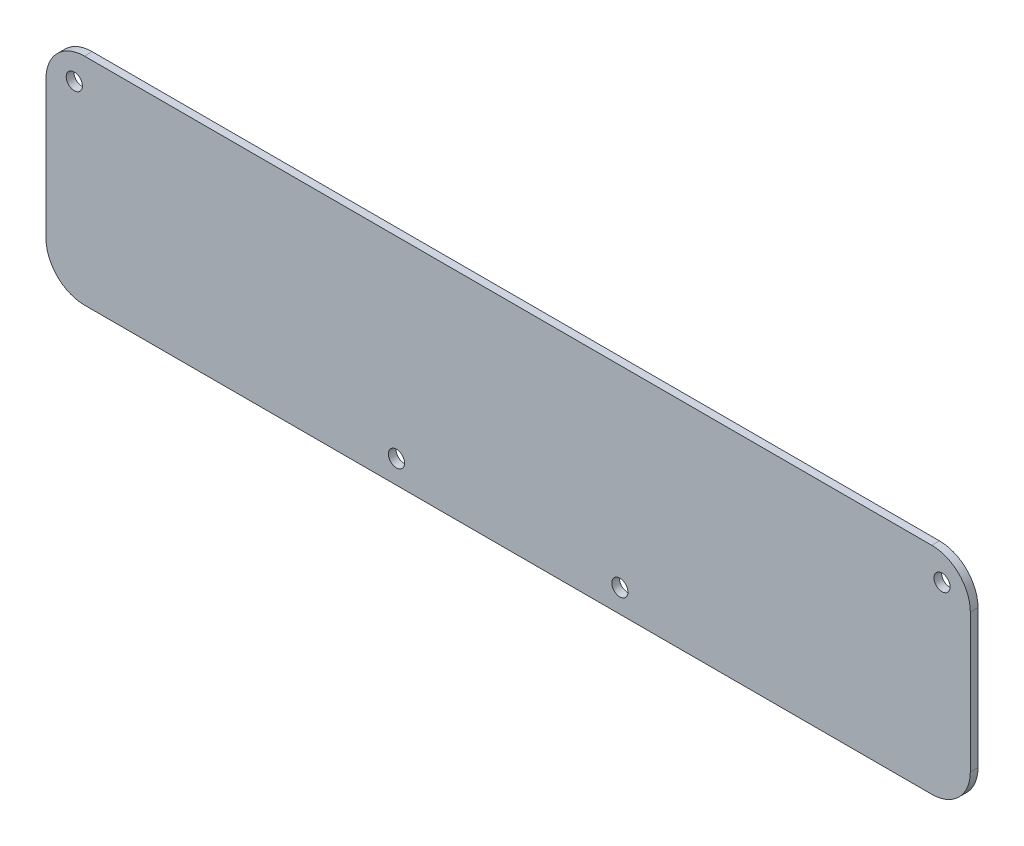
ISO-10303-21;
HEADER;
FILE_DESCRIPTION(('STEP AP214'),'2;1');
FILE_NAME('part.step','',(''),(''),'','','');
FILE_SCHEMA(('AUTOMOTIVE_DESIGN { 1 0 10303 214 1 1 1 1 }'));
ENDSEC;
DATA;
#1=APPLICATION_CONTEXT('core data for automotive mechanical design processes');
#2=APPLICATION_PROTOCOL_DEFINITION('international standard','automotive_design',2000,#1);
#3=PRODUCT_CONTEXT('',#1,'mechanical');
#4=PRODUCT('Part','Part','',(#3));
#5=PRODUCT_RELATED_PRODUCT_CATEGORY('part','',(#4));
#6=PRODUCT_DEFINITION_FORMATION('','',#4);
#7=PRODUCT_DEFINITION_CONTEXT('part definition',#1,'design');
#8=PRODUCT_DEFINITION('design','',#6,#7);
#9=PRODUCT_DEFINITION_SHAPE('','',#8);
#10=(LENGTH_UNIT() NAMED_UNIT(*) SI_UNIT(.MILLI.,.METRE.));
#11=(NAMED_UNIT(*) PLANE_ANGLE_UNIT() SI_UNIT($,.RADIAN.));
#12=(NAMED_UNIT(*) SI_UNIT($,.STERADIAN.) SOLID_ANGLE_UNIT());
#13=UNCERTAINTY_MEASURE_WITH_UNIT(LENGTH_MEASURE(1.E-05),#10,'distance_accuracy_value','');
#14=(GEOMETRIC_REPRESENTATION_CONTEXT(3) GLOBAL_UNCERTAINTY_ASSIGNED_CONTEXT((#13)) GLOBAL_UNIT_ASSIGNED_CONTEXT((#10,
#11,#12)) REPRESENTATION_CONTEXT('',''));
#15=CARTESIAN_POINT('',(0.,0.,0.));
#16=DIRECTION('',(0.,0.,1.));
#17=DIRECTION('',(1.,0.,0.));
#18=AXIS2_PLACEMENT_3D('',#15,#16,#17);
#19=CARTESIAN_POINT('',(-55.,9.0524883481946,1.));
#20=DIRECTION('',(0.,0.,1.));
#21=DIRECTION('',(1.,0.,0.));
#22=AXIS2_PLACEMENT_3D('',#19,#20,#21);
#23=PLANE('',#22);
#24=CARTESIAN_POINT('',(-14.5,-10.9475116518054,1.));
#25=DIRECTION('',(0.,0.,1.));
#26=DIRECTION('',(1.,0.,0.));
#27=AXIS2_PLACEMENT_3D('',#24,#25,#26);
#28=CIRCLE('',#27,1.05);
#29=CARTESIAN_POINT('',(-13.45,-10.9475116518054,1.));
#30=VERTEX_POINT('',#29);
#31=EDGE_CURVE('E191',#30,#30,#28,.T.);
#32=ORIENTED_EDGE('',*,*,#31,.F.);
#33=EDGE_LOOP('',(#32));
#34=FACE_BOUND('',#33,.T.);
#35=CARTESIAN_POINT('',(-56.3279075866655,10.5480355528245,1.));
#36=DIRECTION('',(0.,0.,1.));
#37=DIRECTION('',(1.,0.,0.));
#38=AXIS2_PLACEMENT_3D('',#35,#36,#37);
#39=CIRCLE('',#38,1.05);
#40=CARTESIAN_POINT('',(-55.2779075866655,10.5480355528245,1.));
#41=VERTEX_POINT('',#40);
#42=EDGE_CURVE('E137',#41,#41,#39,.T.);
#43=ORIENTED_EDGE('',*,*,#42,.F.);
#44=EDGE_LOOP('',(#43));
#45=FACE_BOUND('',#44,.T.);
#46=DIRECTION('',(-1.,0.,0.));
#47=VECTOR('',#46,1.);
#48=CARTESIAN_POINT('',(0.,14.0524883481946,1.));
#49=LINE('',#48,#47);
#50=CARTESIAN_POINT('',(55.,14.0524883481946,1.));
#51=VERTEX_POINT('',#50);
#52=CARTESIAN_POINT('',(-55.,14.0524883481946,1.));
#53=VERTEX_POINT('',#52);
#54=EDGE_CURVE('E50',#51,#53,#49,.T.);
#55=ORIENTED_EDGE('',*,*,#54,.T.);
#56=CARTESIAN_POINT('',(-55.,9.0524883481946,1.));
#57=DIRECTION('',(0.,0.,1.));
#58=DIRECTION('',(1.,0.,0.));
#59=AXIS2_PLACEMENT_3D('',#56,#57,#58);
#60=CIRCLE('',#59,5.);
#61=CARTESIAN_POINT('',(-60.,9.0524883481946,1.));
#62=VERTEX_POINT('',#61);
#63=EDGE_CURVE('E94',#53,#62,#60,.T.);
#64=ORIENTED_EDGE('',*,*,#63,.T.);
#65=DIRECTION('',(0.,-1.,0.));
#66=VECTOR('',#65,1.);
#67=CARTESIAN_POINT('',(-60.,9.0524883481946,1.));
#68=LINE('',#67,#66);
#69=CARTESIAN_POINT('',(-60.,-8.9475116518054,1.));
#70=VERTEX_POINT('',#69);
#71=EDGE_CURVE('E163',#62,#70,#68,.T.);
#72=ORIENTED_EDGE('',*,*,#71,.T.);
#73=CARTESIAN_POINT('',(-55.,-8.9475116518054,1.));
#74=DIRECTION('',(0.,0.,1.));
#75=DIRECTION('',(-1.,0.,0.));
#76=AXIS2_PLACEMENT_3D('',#73,#74,#75);
#77=CIRCLE('',#76,5.);
#78=CARTESIAN_POINT('',(-55.,-13.9475116518054,1.));
#79=VERTEX_POINT('',#78);
#80=EDGE_CURVE('E176',#70,#79,#77,.T.);
#81=ORIENTED_EDGE('',*,*,#80,.T.);
#82=DIRECTION('',(1.,0.,0.));
#83=VECTOR('',#82,1.);
#84=CARTESIAN_POINT('',(0.,-13.9475116518054,1.));
#85=LINE('',#84,#83);
#86=CARTESIAN_POINT('',(55.,-13.9475116518054,1.));
#87=VERTEX_POINT('',#86);
#88=EDGE_CURVE('E114',#79,#87,#85,.T.);
#89=ORIENTED_EDGE('',*,*,#88,.T.);
#90=CARTESIAN_POINT('',(55.,-8.94751165180539,1.));
#91=DIRECTION('',(0.,0.,1.));
#92=DIRECTION('',(1.,0.,0.));
#93=AXIS2_PLACEMENT_3D('',#90,#91,#92);
#94=CIRCLE('',#93,5.);
#95=CARTESIAN_POINT('',(60.,-8.94751165180539,1.));
#96=VERTEX_POINT('',#95);
#97=EDGE_CURVE('E108',#87,#96,#94,.T.);
#98=ORIENTED_EDGE('',*,*,#97,.T.);
#99=DIRECTION('',(0.,1.,0.));
#100=VECTOR('',#99,1.);
#101=CARTESIAN_POINT('',(60.,9.05248834819461,1.));
#102=LINE('',#101,#100);
#103=CARTESIAN_POINT('',(60.,9.05248834819461,1.));
#104=VERTEX_POINT('',#103);
#105=EDGE_CURVE('E112',#96,#104,#102,.T.);
#106=ORIENTED_EDGE('',*,*,#105,.T.);
#107=CARTESIAN_POINT('',(55.,9.05248834819461,1.));
#108=DIRECTION('',(0.,0.,1.));
#109=DIRECTION('',(-1.,0.,0.));
#110=AXIS2_PLACEMENT_3D('',#107,#108,#109);
#111=CIRCLE('',#110,5.);
#112=EDGE_CURVE('E128',#104,#51,#111,.T.);
#113=ORIENTED_EDGE('',*,*,#112,.T.);
#114=EDGE_LOOP('',(#55,#64,#72,#81,#89,#98,#106,#113));
#115=FACE_BOUND('',#114,.T.);
#116=CARTESIAN_POINT('',(56.3279075866655,10.5480355528245,1.));
#117=DIRECTION('',(0.,0.,1.));
#118=DIRECTION('',(1.,0.,0.));
#119=AXIS2_PLACEMENT_3D('',#116,#117,#118);
#120=CIRCLE('',#119,1.05);
#121=CARTESIAN_POINT('',(57.3779075866655,10.5480355528245,1.));
#122=VERTEX_POINT('',#121);
#123=EDGE_CURVE('E185',#122,#122,#120,.T.);
#124=ORIENTED_EDGE('',*,*,#123,.F.);
#125=EDGE_LOOP('',(#124));
#126=FACE_BOUND('',#125,.T.);
#127=CARTESIAN_POINT('',(14.5,-10.9475116518054,1.));
#128=DIRECTION('',(0.,0.,1.));
#129=DIRECTION('',(1.,0.,0.));
#130=AXIS2_PLACEMENT_3D('',#127,#128,#129);
#131=CIRCLE('',#130,1.05);
#132=CARTESIAN_POINT('',(15.55,-10.9475116518054,1.));
#133=VERTEX_POINT('',#132);
#134=EDGE_CURVE('E197',#133,#133,#131,.T.);
#135=ORIENTED_EDGE('',*,*,#134,.F.);
#136=EDGE_LOOP('',(#135));
#137=FACE_BOUND('',#136,.T.);
#138=ADVANCED_FACE('F33',(#34,#45,#115,#126,#137),#23,.T.);
#139=CARTESIAN_POINT('',(-55.,9.0524883481946,0.));
#140=DIRECTION('',(0.,0.,1.));
#141=DIRECTION('',(1.,0.,0.));
#142=AXIS2_PLACEMENT_3D('',#139,#140,#141);
#143=PLANE('',#142);
#144=CARTESIAN_POINT('',(-14.5,-10.9475116518054,0.));
#145=DIRECTION('',(0.,0.,1.));
#146=DIRECTION('',(1.,0.,0.));
#147=AXIS2_PLACEMENT_3D('',#144,#145,#146);
#148=CIRCLE('',#147,1.05);
#149=CARTESIAN_POINT('',(-13.45,-10.9475116518054,0.));
#150=VERTEX_POINT('',#149);
#151=EDGE_CURVE('E194',#150,#150,#148,.T.);
#152=ORIENTED_EDGE('',*,*,#151,.T.);
#153=EDGE_LOOP('',(#152));
#154=FACE_BOUND('',#153,.T.);
#155=CARTESIAN_POINT('',(-56.3279075866655,10.5480355528245,0.));
#156=DIRECTION('',(0.,0.,1.));
#157=DIRECTION('',(1.,0.,0.));
#158=AXIS2_PLACEMENT_3D('',#155,#156,#157);
#159=CIRCLE('',#158,1.05);
#160=CARTESIAN_POINT('',(-55.2779075866655,10.5480355528245,0.));
#161=VERTEX_POINT('',#160);
#162=EDGE_CURVE('E182',#161,#161,#159,.T.);
#163=ORIENTED_EDGE('',*,*,#162,.T.);
#164=EDGE_LOOP('',(#163));
#165=FACE_BOUND('',#164,.T.);
#166=CARTESIAN_POINT('',(-55.,9.0524883481946,0.));
#167=DIRECTION('',(0.,0.,1.));
#168=DIRECTION('',(1.,0.,0.));
#169=AXIS2_PLACEMENT_3D('',#166,#167,#168);
#170=CIRCLE('',#169,5.);
#171=CARTESIAN_POINT('',(-55.,14.0524883481946,0.));
#172=VERTEX_POINT('',#171);
#173=CARTESIAN_POINT('',(-60.,9.0524883481946,0.));
#174=VERTEX_POINT('',#173);
#175=EDGE_CURVE('E134',#172,#174,#170,.T.);
#176=ORIENTED_EDGE('',*,*,#175,.F.);
#177=DIRECTION('',(-1.,0.,0.));
#178=VECTOR('',#177,1.);
#179=CARTESIAN_POINT('',(0.,14.0524883481946,0.));
#180=LINE('',#179,#178);
#181=CARTESIAN_POINT('',(55.,14.0524883481946,0.));
#182=VERTEX_POINT('',#181);
#183=EDGE_CURVE('E147',#182,#172,#180,.T.);
#184=ORIENTED_EDGE('',*,*,#183,.F.);
#185=CARTESIAN_POINT('',(55.,9.05248834819461,0.));
#186=DIRECTION('',(0.,0.,1.));
#187=DIRECTION('',(-1.,0.,0.));
#188=AXIS2_PLACEMENT_3D('',#185,#186,#187);
#189=CIRCLE('',#188,5.);
#190=CARTESIAN_POINT('',(60.,9.05248834819461,0.));
#191=VERTEX_POINT('',#190);
#192=EDGE_CURVE('E87',#191,#182,#189,.T.);
#193=ORIENTED_EDGE('',*,*,#192,.F.);
#194=DIRECTION('',(0.,1.,0.));
#195=VECTOR('',#194,1.);
#196=CARTESIAN_POINT('',(60.,9.05248834819461,0.));
#197=LINE('',#196,#195);
#198=CARTESIAN_POINT('',(60.,-8.94751165180539,0.));
#199=VERTEX_POINT('',#198);
#200=EDGE_CURVE('E80',#199,#191,#197,.T.);
#201=ORIENTED_EDGE('',*,*,#200,.F.);
#202=CARTESIAN_POINT('',(55.,-8.94751165180539,0.));
#203=DIRECTION('',(0.,0.,1.));
#204=DIRECTION('',(1.,0.,0.));
#205=AXIS2_PLACEMENT_3D('',#202,#203,#204);
#206=CIRCLE('',#205,5.);
#207=CARTESIAN_POINT('',(55.,-13.9475116518054,0.));
#208=VERTEX_POINT('',#207);
#209=EDGE_CURVE('E122',#208,#199,#206,.T.);
#210=ORIENTED_EDGE('',*,*,#209,.F.);
#211=DIRECTION('',(1.,0.,0.));
#212=VECTOR('',#211,1.);
#213=CARTESIAN_POINT('',(0.,-13.9475116518054,0.));
#214=LINE('',#213,#212);
#215=CARTESIAN_POINT('',(-55.,-13.9475116518054,0.));
#216=VERTEX_POINT('',#215);
#217=EDGE_CURVE('E142',#216,#208,#214,.T.);
#218=ORIENTED_EDGE('',*,*,#217,.F.);
#219=CARTESIAN_POINT('',(-55.,-8.9475116518054,0.));
#220=DIRECTION('',(0.,0.,1.));
#221=DIRECTION('',(-1.,0.,0.));
#222=AXIS2_PLACEMENT_3D('',#219,#220,#221);
#223=CIRCLE('',#222,5.);
#224=CARTESIAN_POINT('',(-60.,-8.9475116518054,0.));
#225=VERTEX_POINT('',#224);
#226=EDGE_CURVE('E139',#225,#216,#223,.T.);
#227=ORIENTED_EDGE('',*,*,#226,.F.);
#228=DIRECTION('',(0.,-1.,0.));
#229=VECTOR('',#228,1.);
#230=CARTESIAN_POINT('',(-60.,9.0524883481946,0.));
#231=LINE('',#230,#229);
#232=EDGE_CURVE('E136',#174,#225,#231,.T.);
#233=ORIENTED_EDGE('',*,*,#232,.F.);
#234=EDGE_LOOP('',(#176,#184,#193,#201,#210,#218,#227,#233));
#235=FACE_BOUND('',#234,.T.);
#236=CARTESIAN_POINT('',(56.3279075866655,10.5480355528245,0.));
#237=DIRECTION('',(0.,0.,1.));
#238=DIRECTION('',(1.,0.,0.));
#239=AXIS2_PLACEMENT_3D('',#236,#237,#238);
#240=CIRCLE('',#239,1.05);
#241=CARTESIAN_POINT('',(57.3779075866655,10.5480355528245,0.));
#242=VERTEX_POINT('',#241);
#243=EDGE_CURVE('E188',#242,#242,#240,.T.);
#244=ORIENTED_EDGE('',*,*,#243,.T.);
#245=EDGE_LOOP('',(#244));
#246=FACE_BOUND('',#245,.T.);
#247=CARTESIAN_POINT('',(14.5,-10.9475116518054,0.));
#248=DIRECTION('',(0.,0.,1.));
#249=DIRECTION('',(1.,0.,0.));
#250=AXIS2_PLACEMENT_3D('',#247,#248,#249);
#251=CIRCLE('',#250,1.05);
#252=CARTESIAN_POINT('',(15.55,-10.9475116518054,0.));
#253=VERTEX_POINT('',#252);
#254=EDGE_CURVE('E200',#253,#253,#251,.T.);
#255=ORIENTED_EDGE('',*,*,#254,.T.);
#256=EDGE_LOOP('',(#255));
#257=FACE_BOUND('',#256,.T.);
#258=ADVANCED_FACE('F167',(#154,#165,#235,#246,#257),#143,.F.);
#259=CARTESIAN_POINT('',(-55.,9.0524883481946,1.));
#260=DIRECTION('',(0.,0.,-1.));
#261=DIRECTION('',(-1.,0.,0.));
#262=AXIS2_PLACEMENT_3D('',#259,#260,#261);
#263=CYLINDRICAL_SURFACE('',#262,5.);
#264=ORIENTED_EDGE('',*,*,#175,.T.);
#265=DIRECTION('',(0.,0.,-1.));
#266=VECTOR('',#265,1.);
#267=CARTESIAN_POINT('',(-60.,9.0524883481946,1.));
#268=LINE('',#267,#266);
#269=EDGE_CURVE('E42',#62,#174,#268,.T.);
#270=ORIENTED_EDGE('',*,*,#269,.F.);
#271=ORIENTED_EDGE('',*,*,#63,.F.);
#272=DIRECTION('',(0.,0.,-1.));
#273=VECTOR('',#272,1.);
#274=CARTESIAN_POINT('',(-55.,14.0524883481946,1.));
#275=LINE('',#274,#273);
#276=EDGE_CURVE('E11',#53,#172,#275,.T.);
#277=ORIENTED_EDGE('',*,*,#276,.T.);
#278=EDGE_LOOP('',(#264,#270,#271,#277));
#279=FACE_BOUND('',#278,.T.);
#280=ADVANCED_FACE('F35',(#279),#263,.T.);
#281=CARTESIAN_POINT('',(-60.,9.0524883481946,1.));
#282=DIRECTION('',(1.,0.,0.));
#283=DIRECTION('',(0.,0.,-1.));
#284=AXIS2_PLACEMENT_3D('',#281,#282,#283);
#285=PLANE('',#284);
#286=ORIENTED_EDGE('',*,*,#232,.T.);
#287=DIRECTION('',(0.,0.,-1.));
#288=VECTOR('',#287,1.);
#289=CARTESIAN_POINT('',(-60.,-8.9475116518054,1.));
#290=LINE('',#289,#288);
#291=EDGE_CURVE('E155',#70,#225,#290,.T.);
#292=ORIENTED_EDGE('',*,*,#291,.F.);
#293=ORIENTED_EDGE('',*,*,#71,.F.);
#294=ORIENTED_EDGE('',*,*,#269,.T.);
#295=EDGE_LOOP('',(#286,#292,#293,#294));
#296=FACE_BOUND('',#295,.T.);
#297=ADVANCED_FACE('F161',(#296),#285,.F.);
#298=CARTESIAN_POINT('',(-55.,-8.9475116518054,1.));
#299=DIRECTION('',(0.,0.,-1.));
#300=DIRECTION('',(-1.,0.,0.));
#301=AXIS2_PLACEMENT_3D('',#298,#299,#300);
#302=CYLINDRICAL_SURFACE('',#301,5.);
#303=ORIENTED_EDGE('',*,*,#226,.T.);
#304=DIRECTION('',(0.,0.,-1.));
#305=VECTOR('',#304,1.);
#306=CARTESIAN_POINT('',(-55.,-13.9475116518054,1.));
#307=LINE('',#306,#305);
#308=EDGE_CURVE('E152',#79,#216,#307,.T.);
#309=ORIENTED_EDGE('',*,*,#308,.F.);
#310=ORIENTED_EDGE('',*,*,#80,.F.);
#311=ORIENTED_EDGE('',*,*,#291,.T.);
#312=EDGE_LOOP('',(#303,#309,#310,#311));
#313=FACE_BOUND('',#312,.T.);
#314=ADVANCED_FACE('F172',(#313),#302,.T.);
#315=CARTESIAN_POINT('',(0.,-13.9475116518054,1.));
#316=DIRECTION('',(0.,1.,0.));
#317=DIRECTION('',(0.,0.,1.));
#318=AXIS2_PLACEMENT_3D('',#315,#316,#317);
#319=PLANE('',#318);
#320=ORIENTED_EDGE('',*,*,#217,.T.);
#321=DIRECTION('',(0.,0.,-1.));
#322=VECTOR('',#321,1.);
#323=CARTESIAN_POINT('',(55.,-13.9475116518054,1.));
#324=LINE('',#323,#322);
#325=EDGE_CURVE('E123',#87,#208,#324,.T.);
#326=ORIENTED_EDGE('',*,*,#325,.F.);
#327=ORIENTED_EDGE('',*,*,#88,.F.);
#328=ORIENTED_EDGE('',*,*,#308,.T.);
#329=EDGE_LOOP('',(#320,#326,#327,#328));
#330=FACE_BOUND('',#329,.T.);
#331=ADVANCED_FACE('F175',(#330),#319,.F.);
#332=CARTESIAN_POINT('',(55.,-8.94751165180539,1.));
#333=DIRECTION('',(0.,0.,-1.));
#334=DIRECTION('',(-1.,0.,0.));
#335=AXIS2_PLACEMENT_3D('',#332,#333,#334);
#336=CYLINDRICAL_SURFACE('',#335,5.);
#337=ORIENTED_EDGE('',*,*,#209,.T.);
#338=DIRECTION('',(0.,0.,-1.));
#339=VECTOR('',#338,1.);
#340=CARTESIAN_POINT('',(60.,-8.94751165180539,1.));
#341=LINE('',#340,#339);
#342=EDGE_CURVE('E119',#96,#199,#341,.T.);
#343=ORIENTED_EDGE('',*,*,#342,.F.);
#344=ORIENTED_EDGE('',*,*,#97,.F.);
#345=ORIENTED_EDGE('',*,*,#325,.T.);
#346=EDGE_LOOP('',(#337,#343,#344,#345));
#347=FACE_BOUND('',#346,.T.);
#348=ADVANCED_FACE('F120',(#347),#336,.T.);
#349=CARTESIAN_POINT('',(60.,9.05248834819461,1.));
#350=DIRECTION('',(-1.,0.,0.));
#351=DIRECTION('',(0.,0.,1.));
#352=AXIS2_PLACEMENT_3D('',#349,#350,#351);
#353=PLANE('',#352);
#354=ORIENTED_EDGE('',*,*,#200,.T.);
#355=DIRECTION('',(0.,0.,-1.));
#356=VECTOR('',#355,1.);
#357=CARTESIAN_POINT('',(60.,9.05248834819461,1.));
#358=LINE('',#357,#356);
#359=EDGE_CURVE('E124',#104,#191,#358,.T.);
#360=ORIENTED_EDGE('',*,*,#359,.F.);
#361=ORIENTED_EDGE('',*,*,#105,.F.);
#362=ORIENTED_EDGE('',*,*,#342,.T.);
#363=EDGE_LOOP('',(#354,#360,#361,#362));
#364=FACE_BOUND('',#363,.T.);
#365=ADVANCED_FACE('F126',(#364),#353,.F.);
#366=CARTESIAN_POINT('',(55.,9.05248834819461,1.));
#367=DIRECTION('',(0.,0.,-1.));
#368=DIRECTION('',(-1.,0.,0.));
#369=AXIS2_PLACEMENT_3D('',#366,#367,#368);
#370=CYLINDRICAL_SURFACE('',#369,5.);
#371=ORIENTED_EDGE('',*,*,#192,.T.);
#372=DIRECTION('',(0.,0.,-1.));
#373=VECTOR('',#372,1.);
#374=CARTESIAN_POINT('',(55.,14.0524883481946,1.));
#375=LINE('',#374,#373);
#376=EDGE_CURVE('E130',#51,#182,#375,.T.);
#377=ORIENTED_EDGE('',*,*,#376,.F.);
#378=ORIENTED_EDGE('',*,*,#112,.F.);
#379=ORIENTED_EDGE('',*,*,#359,.T.);
#380=EDGE_LOOP('',(#371,#377,#378,#379));
#381=FACE_BOUND('',#380,.T.);
#382=ADVANCED_FACE('F226',(#381),#370,.T.);
#383=CARTESIAN_POINT('',(0.,14.0524883481946,1.));
#384=DIRECTION('',(0.,-1.,0.));
#385=DIRECTION('',(0.,0.,-1.));
#386=AXIS2_PLACEMENT_3D('',#383,#384,#385);
#387=PLANE('',#386);
#388=ORIENTED_EDGE('',*,*,#183,.T.);
#389=ORIENTED_EDGE('',*,*,#276,.F.);
#390=ORIENTED_EDGE('',*,*,#54,.F.);
#391=ORIENTED_EDGE('',*,*,#376,.T.);
#392=EDGE_LOOP('',(#388,#389,#390,#391));
#393=FACE_BOUND('',#392,.T.);
#394=ADVANCED_FACE('F223',(#393),#387,.F.);
#395=CARTESIAN_POINT('',(-56.3279075866655,10.5480355528245,1.));
#396=DIRECTION('',(0.,0.,-1.));
#397=DIRECTION('',(-1.,0.,0.));
#398=AXIS2_PLACEMENT_3D('',#395,#396,#397);
#399=CYLINDRICAL_SURFACE('',#398,1.05);
#400=ORIENTED_EDGE('',*,*,#42,.T.);
#401=EDGE_LOOP('',(#400));
#402=FACE_BOUND('',#401,.T.);
#403=ORIENTED_EDGE('',*,*,#162,.F.);
#404=EDGE_LOOP('',(#403));
#405=FACE_BOUND('',#404,.T.);
#406=ADVANCED_FACE('F220',(#402,#405),#399,.F.);
#407=CARTESIAN_POINT('',(56.3279075866655,10.5480355528245,1.));
#408=DIRECTION('',(0.,0.,-1.));
#409=DIRECTION('',(-1.,0.,0.));
#410=AXIS2_PLACEMENT_3D('',#407,#408,#409);
#411=CYLINDRICAL_SURFACE('',#410,1.05);
#412=ORIENTED_EDGE('',*,*,#123,.T.);
#413=EDGE_LOOP('',(#412));
#414=FACE_BOUND('',#413,.T.);
#415=ORIENTED_EDGE('',*,*,#243,.F.);
#416=EDGE_LOOP('',(#415));
#417=FACE_BOUND('',#416,.T.);
#418=ADVANCED_FACE('F302',(#414,#417),#411,.F.);
#419=CARTESIAN_POINT('',(-14.5,-10.9475116518054,1.));
#420=DIRECTION('',(0.,0.,-1.));
#421=DIRECTION('',(-1.,0.,0.));
#422=AXIS2_PLACEMENT_3D('',#419,#420,#421);
#423=CYLINDRICAL_SURFACE('',#422,1.05);
#424=ORIENTED_EDGE('',*,*,#31,.T.);
#425=EDGE_LOOP('',(#424));
#426=FACE_BOUND('',#425,.T.);
#427=ORIENTED_EDGE('',*,*,#151,.F.);
#428=EDGE_LOOP('',(#427));
#429=FACE_BOUND('',#428,.T.);
#430=ADVANCED_FACE('F310',(#426,#429),#423,.F.);
#431=CARTESIAN_POINT('',(14.5,-10.9475116518054,1.));
#432=DIRECTION('',(0.,0.,-1.));
#433=DIRECTION('',(-1.,0.,0.));
#434=AXIS2_PLACEMENT_3D('',#431,#432,#433);
#435=CYLINDRICAL_SURFACE('',#434,1.05);
#436=ORIENTED_EDGE('',*,*,#134,.T.);
#437=EDGE_LOOP('',(#436));
#438=FACE_BOUND('',#437,.T.);
#439=ORIENTED_EDGE('',*,*,#254,.F.);
#440=EDGE_LOOP('',(#439));
#441=FACE_BOUND('',#440,.T.);
#442=ADVANCED_FACE('F206',(#438,#441),#435,.F.);
#443=CLOSED_SHELL('',(#138,#258,#280,#297,#314,#331,#348,#365,#382,#394,#406,#418,#430,#442));
#444=MANIFOLD_SOLID_BREP('B2',#443);
#445=ADVANCED_BREP_SHAPE_REPRESENTATION('',(#18,#444),#14);
#446=SHAPE_DEFINITION_REPRESENTATION(#9,#445);
ENDSEC;
END-ISO-10303-21;
